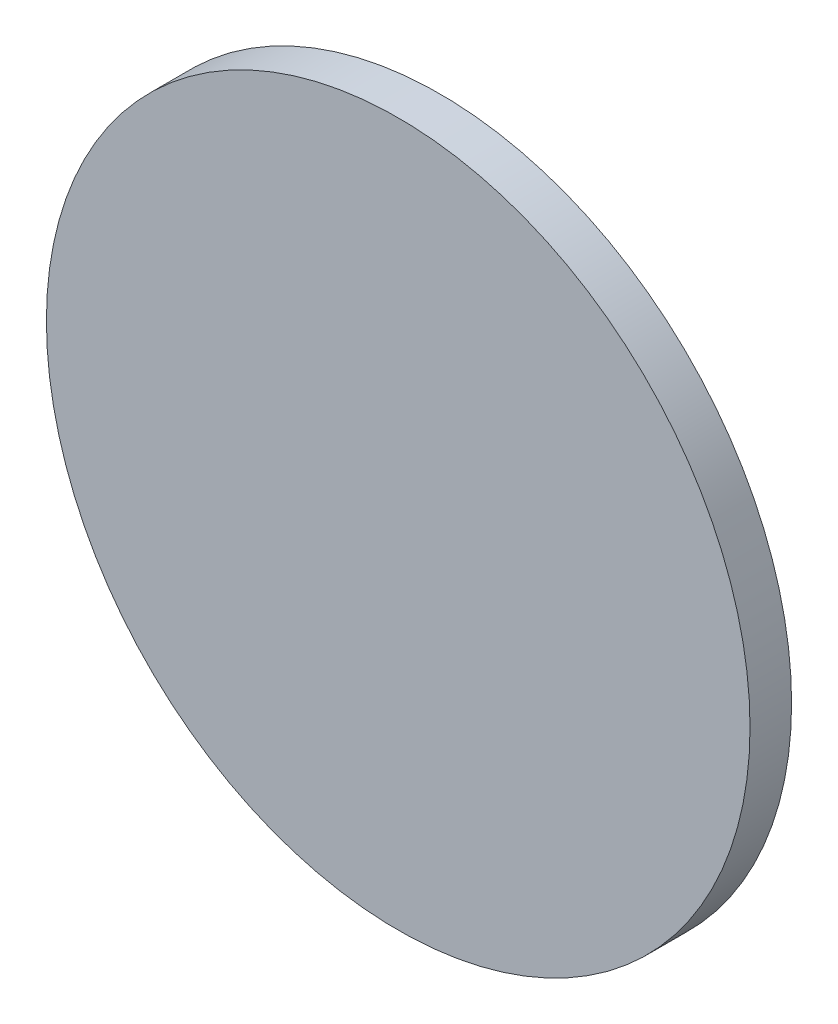
ISO-10303-21;
HEADER;
FILE_DESCRIPTION(('STEP AP214'),'2;1');
FILE_NAME('part.step','',(''),(''),'','','');
FILE_SCHEMA(('AUTOMOTIVE_DESIGN { 1 0 10303 214 1 1 1 1 }'));
ENDSEC;
DATA;
#1=APPLICATION_CONTEXT('core data for automotive mechanical design processes');
#2=APPLICATION_PROTOCOL_DEFINITION('international standard','automotive_design',2000,#1);
#3=PRODUCT_CONTEXT('',#1,'mechanical');
#4=PRODUCT('Part','Part','',(#3));
#5=PRODUCT_RELATED_PRODUCT_CATEGORY('part','',(#4));
#6=PRODUCT_DEFINITION_FORMATION('','',#4);
#7=PRODUCT_DEFINITION_CONTEXT('part definition',#1,'design');
#8=PRODUCT_DEFINITION('design','',#6,#7);
#9=PRODUCT_DEFINITION_SHAPE('','',#8);
#10=(LENGTH_UNIT() NAMED_UNIT(*) SI_UNIT(.MILLI.,.METRE.));
#11=(NAMED_UNIT(*) PLANE_ANGLE_UNIT() SI_UNIT($,.RADIAN.));
#12=(NAMED_UNIT(*) SI_UNIT($,.STERADIAN.) SOLID_ANGLE_UNIT());
#13=UNCERTAINTY_MEASURE_WITH_UNIT(LENGTH_MEASURE(1.E-05),#10,'distance_accuracy_value','');
#14=(GEOMETRIC_REPRESENTATION_CONTEXT(3) GLOBAL_UNCERTAINTY_ASSIGNED_CONTEXT((#13)) GLOBAL_UNIT_ASSIGNED_CONTEXT((#10,
#11,#12)) REPRESENTATION_CONTEXT('',''));
#15=CARTESIAN_POINT('',(0.,0.,0.));
#16=DIRECTION('',(0.,0.,1.));
#17=DIRECTION('',(1.,0.,0.));
#18=AXIS2_PLACEMENT_3D('',#15,#16,#17);
#19=CARTESIAN_POINT('',(0.,0.,3.));
#20=DIRECTION('',(0.,0.,-1.));
#21=DIRECTION('',(-1.,0.,0.));
#22=AXIS2_PLACEMENT_3D('',#19,#20,#21);
#23=CYLINDRICAL_SURFACE('',#22,25.4);
#24=CARTESIAN_POINT('',(0.,0.,3.));
#25=DIRECTION('',(0.,0.,1.));
#26=DIRECTION('',(1.,0.,0.));
#27=AXIS2_PLACEMENT_3D('',#24,#25,#26);
#28=CIRCLE('',#27,25.4);
#29=CARTESIAN_POINT('',(25.4,0.,3.));
#30=VERTEX_POINT('',#29);
#31=EDGE_CURVE('E10',#30,#30,#28,.T.);
#32=ORIENTED_EDGE('',*,*,#31,.F.);
#33=EDGE_LOOP('',(#32));
#34=FACE_BOUND('',#33,.T.);
#35=CARTESIAN_POINT('',(0.,0.,0.));
#36=DIRECTION('',(0.,0.,1.));
#37=DIRECTION('',(1.,0.,0.));
#38=AXIS2_PLACEMENT_3D('',#35,#36,#37);
#39=CIRCLE('',#38,25.4);
#40=CARTESIAN_POINT('',(25.4,0.,0.));
#41=VERTEX_POINT('',#40);
#42=EDGE_CURVE('E33',#41,#41,#39,.T.);
#43=ORIENTED_EDGE('',*,*,#42,.T.);
#44=EDGE_LOOP('',(#43));
#45=FACE_BOUND('',#44,.T.);
#46=ADVANCED_FACE('F30',(#34,#45),#23,.T.);
#47=CARTESIAN_POINT('',(0.,0.,3.));
#48=DIRECTION('',(0.,0.,1.));
#49=DIRECTION('',(1.,0.,0.));
#50=AXIS2_PLACEMENT_3D('',#47,#48,#49);
#51=PLANE('',#50);
#52=ORIENTED_EDGE('',*,*,#31,.T.);
#53=EDGE_LOOP('',(#52));
#54=FACE_BOUND('',#53,.T.);
#55=ADVANCED_FACE('F45',(#54),#51,.T.);
#56=CARTESIAN_POINT('',(0.,0.,0.));
#57=DIRECTION('',(0.,0.,1.));
#58=DIRECTION('',(1.,0.,0.));
#59=AXIS2_PLACEMENT_3D('',#56,#57,#58);
#60=PLANE('',#59);
#61=ORIENTED_EDGE('',*,*,#42,.F.);
#62=EDGE_LOOP('',(#61));
#63=FACE_BOUND('',#62,.T.);
#64=ADVANCED_FACE('F43',(#63),#60,.F.);
#65=CLOSED_SHELL('',(#46,#55,#64));
#66=MANIFOLD_SOLID_BREP('B2',#65);
#67=ADVANCED_BREP_SHAPE_REPRESENTATION('',(#18,#66),#14);
#68=SHAPE_DEFINITION_REPRESENTATION(#9,#67);
ENDSEC;
END-ISO-10303-21;
